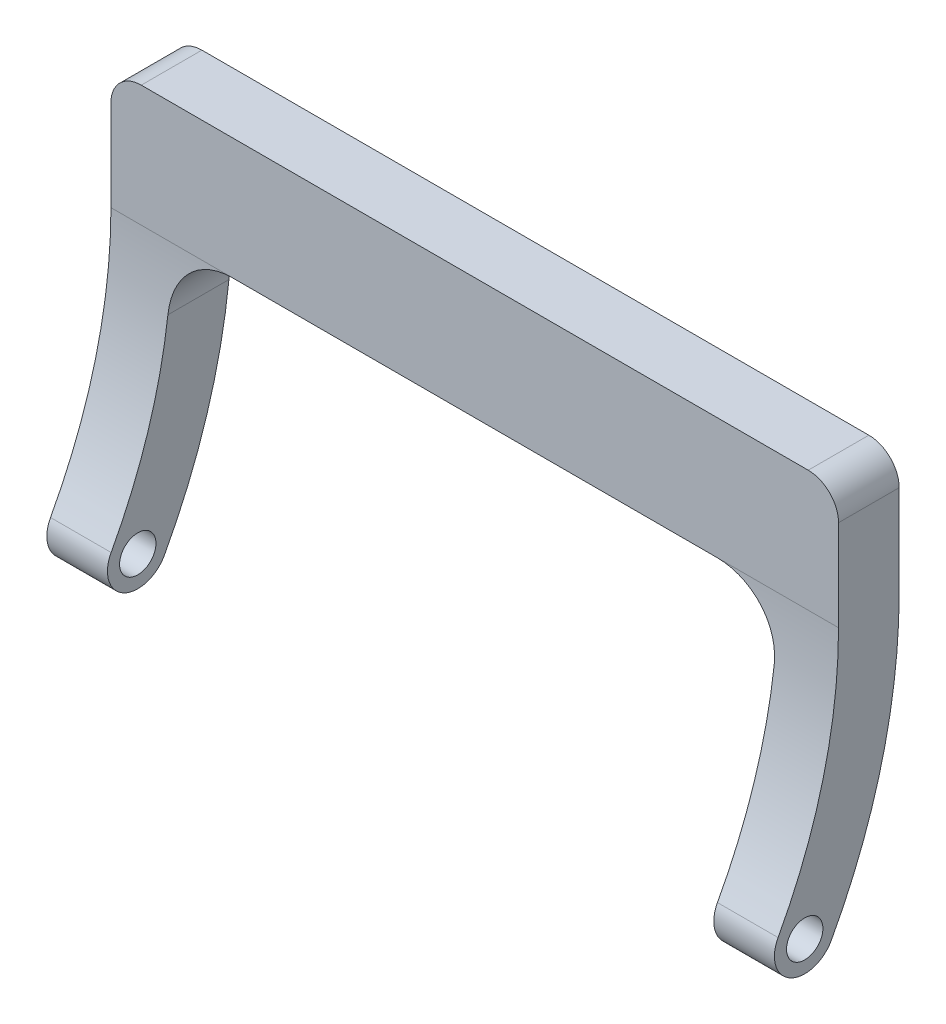
ISO-10303-21;
HEADER;
FILE_DESCRIPTION(('STEP AP214'),'2;1');
FILE_NAME('part.step','',(''),(''),'','','');
FILE_SCHEMA(('AUTOMOTIVE_DESIGN { 1 0 10303 214 1 1 1 1 }'));
ENDSEC;
DATA;
#1=APPLICATION_CONTEXT('core data for automotive mechanical design processes');
#2=APPLICATION_PROTOCOL_DEFINITION('international standard','automotive_design',2000,#1);
#3=PRODUCT_CONTEXT('',#1,'mechanical');
#4=PRODUCT('Part','Part','',(#3));
#5=PRODUCT_RELATED_PRODUCT_CATEGORY('part','',(#4));
#6=PRODUCT_DEFINITION_FORMATION('','',#4);
#7=PRODUCT_DEFINITION_CONTEXT('part definition',#1,'design');
#8=PRODUCT_DEFINITION('design','',#6,#7);
#9=PRODUCT_DEFINITION_SHAPE('','',#8);
#10=(LENGTH_UNIT() NAMED_UNIT(*) SI_UNIT(.MILLI.,.METRE.));
#11=(NAMED_UNIT(*) PLANE_ANGLE_UNIT() SI_UNIT($,.RADIAN.));
#12=(NAMED_UNIT(*) SI_UNIT($,.STERADIAN.) SOLID_ANGLE_UNIT());
#13=UNCERTAINTY_MEASURE_WITH_UNIT(LENGTH_MEASURE(1.E-05),#10,'distance_accuracy_value','');
#14=(GEOMETRIC_REPRESENTATION_CONTEXT(3) GLOBAL_UNCERTAINTY_ASSIGNED_CONTEXT((#13)) GLOBAL_UNIT_ASSIGNED_CONTEXT((#10,
#11,#12)) REPRESENTATION_CONTEXT('',''));
#15=CARTESIAN_POINT('',(0.,0.,0.));
#16=DIRECTION('',(0.,0.,1.));
#17=DIRECTION('',(1.,0.,0.));
#18=AXIS2_PLACEMENT_3D('',#15,#16,#17);
#19=CARTESIAN_POINT('',(-30.,-5.,5.));
#20=DIRECTION('',(0.,1.,0.));
#21=DIRECTION('',(0.,0.,1.));
#22=AXIS2_PLACEMENT_3D('',#19,#20,#21);
#23=PLANE('',#22);
#24=DIRECTION('',(1.,0.,0.));
#25=VECTOR('',#24,1.);
#26=CARTESIAN_POINT('',(-30.,-5.,5.));
#27=LINE('',#26,#25);
#28=CARTESIAN_POINT('',(-20.,-5.,5.));
#29=VERTEX_POINT('',#28);
#30=CARTESIAN_POINT('',(20.,-5.,5.));
#31=VERTEX_POINT('',#30);
#32=EDGE_CURVE('E253',#29,#31,#27,.T.);
#33=ORIENTED_EDGE('',*,*,#32,.F.);
#34=DIRECTION('',(0.,0.,1.));
#35=VECTOR('',#34,1.);
#36=CARTESIAN_POINT('',(-20.,-5.,0.));
#37=LINE('',#36,#35);
#38=CARTESIAN_POINT('',(-20.,-5.,0.));
#39=VERTEX_POINT('',#38);
#40=EDGE_CURVE('E111',#29,#39,#37,.F.);
#41=ORIENTED_EDGE('',*,*,#40,.T.);
#42=DIRECTION('',(1.,0.,0.));
#43=VECTOR('',#42,1.);
#44=CARTESIAN_POINT('',(-30.,-5.,0.));
#45=LINE('',#44,#43);
#46=CARTESIAN_POINT('',(20.,-5.,0.));
#47=VERTEX_POINT('',#46);
#48=EDGE_CURVE('E268',#39,#47,#45,.T.);
#49=ORIENTED_EDGE('',*,*,#48,.T.);
#50=DIRECTION('',(0.,0.,1.));
#51=VECTOR('',#50,1.);
#52=CARTESIAN_POINT('',(20.,-5.,5.));
#53=LINE('',#52,#51);
#54=EDGE_CURVE('E123',#47,#31,#53,.T.);
#55=ORIENTED_EDGE('',*,*,#54,.T.);
#56=EDGE_LOOP('',(#33,#41,#49,#55));
#57=FACE_BOUND('',#56,.T.);
#58=ADVANCED_FACE('F35',(#57),#23,.F.);
#59=CARTESIAN_POINT('',(30.,2.5,5.));
#60=DIRECTION('',(-1.,0.,0.));
#61=DIRECTION('',(0.,-1.,0.));
#62=AXIS2_PLACEMENT_3D('',#59,#60,#61);
#63=PLANE('',#62);
#64=DIRECTION('',(0.,1.,0.));
#65=VECTOR('',#64,1.);
#66=CARTESIAN_POINT('',(30.,2.5,0.));
#67=LINE('',#66,#65);
#68=CARTESIAN_POINT('',(30.,-5.,0.));
#69=VERTEX_POINT('',#68);
#70=CARTESIAN_POINT('',(30.,2.5,0.));
#71=VERTEX_POINT('',#70);
#72=EDGE_CURVE('E235',#69,#71,#67,.T.);
#73=ORIENTED_EDGE('',*,*,#72,.T.);
#74=DIRECTION('',(0.,0.,-1.));
#75=VECTOR('',#74,1.);
#76=CARTESIAN_POINT('',(30.,2.5,5.));
#77=LINE('',#76,#75);
#78=CARTESIAN_POINT('',(30.,2.5,5.));
#79=VERTEX_POINT('',#78);
#80=EDGE_CURVE('E129',#79,#71,#77,.T.);
#81=ORIENTED_EDGE('',*,*,#80,.F.);
#82=DIRECTION('',(0.,1.,0.));
#83=VECTOR('',#82,1.);
#84=CARTESIAN_POINT('',(30.,2.5,5.));
#85=LINE('',#84,#83);
#86=CARTESIAN_POINT('',(30.,-5.,5.));
#87=VERTEX_POINT('',#86);
#88=EDGE_CURVE('E238',#87,#79,#85,.T.);
#89=ORIENTED_EDGE('',*,*,#88,.F.);
#90=CARTESIAN_POINT('',(30.,-4.99999999999999,46.1643761087956));
#91=DIRECTION('',(-1.,0.,0.));
#92=DIRECTION('',(0.,0.,1.));
#93=AXIS2_PLACEMENT_3D('',#90,#91,#92);
#94=CIRCLE('',#93,41.1643761087957);
#95=CARTESIAN_POINT('',(30.,-24.6359543331277,9.98516719188165));
#96=VERTEX_POINT('',#95);
#97=EDGE_CURVE('E367',#87,#96,#94,.T.);
#98=ORIENTED_EDGE('',*,*,#97,.T.);
#99=CARTESIAN_POINT('',(30.,-25.8284875493017,7.78792698463948));
#100=DIRECTION('',(-1.,0.,0.));
#101=DIRECTION('',(0.,0.,1.));
#102=AXIS2_PLACEMENT_3D('',#99,#100,#101);
#103=CIRCLE('',#102,2.5);
#104=CARTESIAN_POINT('',(30.,-27.0210207654758,5.59068677739731));
#105=VERTEX_POINT('',#104);
#106=EDGE_CURVE('E376',#105,#96,#103,.T.);
#107=ORIENTED_EDGE('',*,*,#106,.F.);
#108=CARTESIAN_POINT('',(30.,-4.99999999999999,46.1643761087956));
#109=DIRECTION('',(-1.,0.,0.));
#110=DIRECTION('',(0.,0.,1.));
#111=AXIS2_PLACEMENT_3D('',#108,#109,#110);
#112=CIRCLE('',#111,46.1643761087956);
#113=EDGE_CURVE('E291',#69,#105,#112,.T.);
#114=ORIENTED_EDGE('',*,*,#113,.F.);
#115=EDGE_LOOP('',(#73,#81,#89,#98,#107,#114));
#116=FACE_BOUND('',#115,.T.);
#117=CARTESIAN_POINT('',(30.,-25.8284875493017,7.78792698463948));
#118=DIRECTION('',(-1.,0.,0.));
#119=DIRECTION('',(0.,0.,1.));
#120=AXIS2_PLACEMENT_3D('',#117,#118,#119);
#121=CIRCLE('',#120,1.5);
#122=CARTESIAN_POINT('',(30.,-25.8284875493017,9.28792698463948));
#123=VERTEX_POINT('',#122);
#124=EDGE_CURVE('E364',#123,#123,#121,.T.);
#125=ORIENTED_EDGE('',*,*,#124,.T.);
#126=EDGE_LOOP('',(#125));
#127=FACE_BOUND('',#126,.T.);
#128=ADVANCED_FACE('F153',(#116,#127),#63,.F.);
#129=CARTESIAN_POINT('',(27.5,2.5,5.));
#130=DIRECTION('',(0.,0.,-1.));
#131=DIRECTION('',(-1.,0.,0.));
#132=AXIS2_PLACEMENT_3D('',#129,#130,#131);
#133=CYLINDRICAL_SURFACE('',#132,2.5);
#134=CARTESIAN_POINT('',(27.5,2.5,0.));
#135=DIRECTION('',(0.,0.,1.));
#136=DIRECTION('',(-1.,0.,0.));
#137=AXIS2_PLACEMENT_3D('',#134,#135,#136);
#138=CIRCLE('',#137,2.5);
#139=CARTESIAN_POINT('',(27.5,5.,0.));
#140=VERTEX_POINT('',#139);
#141=EDGE_CURVE('E258',#71,#140,#138,.T.);
#142=ORIENTED_EDGE('',*,*,#141,.T.);
#143=DIRECTION('',(0.,0.,-1.));
#144=VECTOR('',#143,1.);
#145=CARTESIAN_POINT('',(27.5,5.,5.));
#146=LINE('',#145,#144);
#147=CARTESIAN_POINT('',(27.5,5.,5.));
#148=VERTEX_POINT('',#147);
#149=EDGE_CURVE('E274',#148,#140,#146,.T.);
#150=ORIENTED_EDGE('',*,*,#149,.F.);
#151=CARTESIAN_POINT('',(27.5,2.5,5.));
#152=DIRECTION('',(0.,0.,1.));
#153=DIRECTION('',(-1.,0.,0.));
#154=AXIS2_PLACEMENT_3D('',#151,#152,#153);
#155=CIRCLE('',#154,2.5);
#156=EDGE_CURVE('E241',#79,#148,#155,.T.);
#157=ORIENTED_EDGE('',*,*,#156,.F.);
#158=ORIENTED_EDGE('',*,*,#80,.T.);
#159=EDGE_LOOP('',(#142,#150,#157,#158));
#160=FACE_BOUND('',#159,.T.);
#161=ADVANCED_FACE('F157',(#160),#133,.T.);
#162=CARTESIAN_POINT('',(-27.5,5.,5.));
#163=DIRECTION('',(0.,-1.,0.));
#164=DIRECTION('',(0.,0.,-1.));
#165=AXIS2_PLACEMENT_3D('',#162,#163,#164);
#166=PLANE('',#165);
#167=DIRECTION('',(-1.,0.,0.));
#168=VECTOR('',#167,1.);
#169=CARTESIAN_POINT('',(-27.5,5.,0.));
#170=LINE('',#169,#168);
#171=CARTESIAN_POINT('',(-27.5,5.,0.));
#172=VERTEX_POINT('',#171);
#173=EDGE_CURVE('E261',#140,#172,#170,.T.);
#174=ORIENTED_EDGE('',*,*,#173,.T.);
#175=DIRECTION('',(0.,0.,-1.));
#176=VECTOR('',#175,1.);
#177=CARTESIAN_POINT('',(-27.5,5.,5.));
#178=LINE('',#177,#176);
#179=CARTESIAN_POINT('',(-27.5,5.,5.));
#180=VERTEX_POINT('',#179);
#181=EDGE_CURVE('E271',#180,#172,#178,.T.);
#182=ORIENTED_EDGE('',*,*,#181,.F.);
#183=DIRECTION('',(-1.,0.,0.));
#184=VECTOR('',#183,1.);
#185=CARTESIAN_POINT('',(-27.5,5.,5.));
#186=LINE('',#185,#184);
#187=EDGE_CURVE('E245',#148,#180,#186,.T.);
#188=ORIENTED_EDGE('',*,*,#187,.F.);
#189=ORIENTED_EDGE('',*,*,#149,.T.);
#190=EDGE_LOOP('',(#174,#182,#188,#189));
#191=FACE_BOUND('',#190,.T.);
#192=ADVANCED_FACE('F161',(#191),#166,.F.);
#193=CARTESIAN_POINT('',(-27.5,2.5,5.));
#194=DIRECTION('',(0.,0.,-1.));
#195=DIRECTION('',(-1.,0.,0.));
#196=AXIS2_PLACEMENT_3D('',#193,#194,#195);
#197=CYLINDRICAL_SURFACE('',#196,2.5);
#198=CARTESIAN_POINT('',(-27.5,2.5,0.));
#199=DIRECTION('',(0.,0.,1.));
#200=DIRECTION('',(1.,0.,0.));
#201=AXIS2_PLACEMENT_3D('',#198,#199,#200);
#202=CIRCLE('',#201,2.5);
#203=CARTESIAN_POINT('',(-30.,2.5,0.));
#204=VERTEX_POINT('',#203);
#205=EDGE_CURVE('E264',#172,#204,#202,.T.);
#206=ORIENTED_EDGE('',*,*,#205,.T.);
#207=DIRECTION('',(0.,0.,-1.));
#208=VECTOR('',#207,1.);
#209=CARTESIAN_POINT('',(-30.,2.5,5.));
#210=LINE('',#209,#208);
#211=CARTESIAN_POINT('',(-30.,2.5,5.));
#212=VERTEX_POINT('',#211);
#213=EDGE_CURVE('E255',#212,#204,#210,.T.);
#214=ORIENTED_EDGE('',*,*,#213,.F.);
#215=CARTESIAN_POINT('',(-27.5,2.5,5.));
#216=DIRECTION('',(0.,0.,1.));
#217=DIRECTION('',(1.,0.,0.));
#218=AXIS2_PLACEMENT_3D('',#215,#216,#217);
#219=CIRCLE('',#218,2.5);
#220=EDGE_CURVE('E248',#180,#212,#219,.T.);
#221=ORIENTED_EDGE('',*,*,#220,.F.);
#222=ORIENTED_EDGE('',*,*,#181,.T.);
#223=EDGE_LOOP('',(#206,#214,#221,#222));
#224=FACE_BOUND('',#223,.T.);
#225=ADVANCED_FACE('F165',(#224),#197,.T.);
#226=CARTESIAN_POINT('',(-30.,2.5,5.));
#227=DIRECTION('',(1.,0.,0.));
#228=DIRECTION('',(0.,1.,0.));
#229=AXIS2_PLACEMENT_3D('',#226,#227,#228);
#230=PLANE('',#229);
#231=DIRECTION('',(0.,-1.,0.));
#232=VECTOR('',#231,1.);
#233=CARTESIAN_POINT('',(-30.,2.5,0.));
#234=LINE('',#233,#232);
#235=CARTESIAN_POINT('',(-30.,-5.,0.));
#236=VERTEX_POINT('',#235);
#237=EDGE_CURVE('E224',#204,#236,#234,.T.);
#238=ORIENTED_EDGE('',*,*,#237,.T.);
#239=CARTESIAN_POINT('',(-30.,-4.99999999999999,46.1643761087956));
#240=DIRECTION('',(-1.,0.,0.));
#241=DIRECTION('',(0.,0.,1.));
#242=AXIS2_PLACEMENT_3D('',#239,#240,#241);
#243=CIRCLE('',#242,46.1643761087956);
#244=CARTESIAN_POINT('',(-30.,-27.0210207654758,5.59068677739731));
#245=VERTEX_POINT('',#244);
#246=EDGE_CURVE('E216',#236,#245,#243,.T.);
#247=ORIENTED_EDGE('',*,*,#246,.T.);
#248=CARTESIAN_POINT('',(-30.,-25.8284875493017,7.78792698463948));
#249=DIRECTION('',(-1.,0.,0.));
#250=DIRECTION('',(0.,0.,1.));
#251=AXIS2_PLACEMENT_3D('',#248,#249,#250);
#252=CIRCLE('',#251,2.5);
#253=CARTESIAN_POINT('',(-30.,-24.6359543331277,9.98516719188165));
#254=VERTEX_POINT('',#253);
#255=EDGE_CURVE('E202',#245,#254,#252,.T.);
#256=ORIENTED_EDGE('',*,*,#255,.T.);
#257=CARTESIAN_POINT('',(-30.,-4.99999999999999,46.1643761087956));
#258=DIRECTION('',(-1.,0.,0.));
#259=DIRECTION('',(0.,0.,1.));
#260=AXIS2_PLACEMENT_3D('',#257,#258,#259);
#261=CIRCLE('',#260,41.1643761087957);
#262=CARTESIAN_POINT('',(-30.,-5.,5.));
#263=VERTEX_POINT('',#262);
#264=EDGE_CURVE('E215',#263,#254,#261,.T.);
#265=ORIENTED_EDGE('',*,*,#264,.F.);
#266=DIRECTION('',(0.,-1.,0.));
#267=VECTOR('',#266,1.);
#268=CARTESIAN_POINT('',(-30.,2.5,5.));
#269=LINE('',#268,#267);
#270=EDGE_CURVE('E251',#212,#263,#269,.T.);
#271=ORIENTED_EDGE('',*,*,#270,.F.);
#272=ORIENTED_EDGE('',*,*,#213,.T.);
#273=EDGE_LOOP('',(#238,#247,#256,#265,#271,#272));
#274=FACE_BOUND('',#273,.T.);
#275=CARTESIAN_POINT('',(-30.,-25.8284875493017,7.78792698463948));
#276=DIRECTION('',(-1.,0.,0.));
#277=DIRECTION('',(0.,0.,1.));
#278=AXIS2_PLACEMENT_3D('',#275,#276,#277);
#279=CIRCLE('',#278,1.5);
#280=CARTESIAN_POINT('',(-30.,-25.8284875493017,9.28792698463948));
#281=VERTEX_POINT('',#280);
#282=EDGE_CURVE('E226',#281,#281,#279,.T.);
#283=ORIENTED_EDGE('',*,*,#282,.F.);
#284=EDGE_LOOP('',(#283));
#285=FACE_BOUND('',#284,.T.);
#286=ADVANCED_FACE('F169',(#274,#285),#230,.F.);
#287=CARTESIAN_POINT('',(-27.5,2.5,5.));
#288=DIRECTION('',(0.,0.,1.));
#289=DIRECTION('',(1.,0.,0.));
#290=AXIS2_PLACEMENT_3D('',#287,#288,#289);
#291=PLANE('',#290);
#292=ORIENTED_EDGE('',*,*,#88,.T.);
#293=ORIENTED_EDGE('',*,*,#156,.T.);
#294=ORIENTED_EDGE('',*,*,#187,.T.);
#295=ORIENTED_EDGE('',*,*,#220,.T.);
#296=ORIENTED_EDGE('',*,*,#270,.T.);
#297=EDGE_CURVE('E65',#263,#29,#27,.T.);
#298=ORIENTED_EDGE('',*,*,#297,.T.);
#299=ORIENTED_EDGE('',*,*,#32,.T.);
#300=DIRECTION('',(1.,0.,0.));
#301=VECTOR('',#300,1.);
#302=CARTESIAN_POINT('',(25.,-5.,5.));
#303=LINE('',#302,#301);
#304=EDGE_CURVE('E80',#31,#87,#303,.T.);
#305=ORIENTED_EDGE('',*,*,#304,.T.);
#306=EDGE_LOOP('',(#292,#293,#294,#295,#296,#298,#299,#305));
#307=FACE_BOUND('',#306,.T.);
#308=ADVANCED_FACE('F173',(#307),#291,.T.);
#309=CARTESIAN_POINT('',(-27.5,2.5,0.));
#310=DIRECTION('',(0.,0.,1.));
#311=DIRECTION('',(1.,0.,0.));
#312=AXIS2_PLACEMENT_3D('',#309,#310,#311);
#313=PLANE('',#312);
#314=ORIENTED_EDGE('',*,*,#72,.F.);
#315=DIRECTION('',(1.,0.,0.));
#316=VECTOR('',#315,1.);
#317=CARTESIAN_POINT('',(25.,-5.,0.));
#318=LINE('',#317,#316);
#319=EDGE_CURVE('E56',#47,#69,#318,.T.);
#320=ORIENTED_EDGE('',*,*,#319,.F.);
#321=ORIENTED_EDGE('',*,*,#48,.F.);
#322=EDGE_CURVE('E242',#236,#39,#45,.T.);
#323=ORIENTED_EDGE('',*,*,#322,.F.);
#324=ORIENTED_EDGE('',*,*,#237,.F.);
#325=ORIENTED_EDGE('',*,*,#205,.F.);
#326=ORIENTED_EDGE('',*,*,#173,.F.);
#327=ORIENTED_EDGE('',*,*,#141,.F.);
#328=EDGE_LOOP('',(#314,#320,#321,#323,#324,#325,#326,#327));
#329=FACE_BOUND('',#328,.T.);
#330=ADVANCED_FACE('F177',(#329),#313,.F.);
#331=CARTESIAN_POINT('',(-25.,-4.99999999999999,46.1643761087956));
#332=DIRECTION('',(-1.,0.,0.));
#333=DIRECTION('',(0.,0.,1.));
#334=AXIS2_PLACEMENT_3D('',#331,#332,#333);
#335=CYLINDRICAL_SURFACE('',#334,46.1643761087956);
#336=ORIENTED_EDGE('',*,*,#246,.F.);
#337=ORIENTED_EDGE('',*,*,#322,.T.);
#338=CARTESIAN_POINT('',(-20.,-5.,0.));
#339=CARTESIAN_POINT('',(-20.1406139638009,-4.99998488468588,4.83904575289081E-06));
#340=CARTESIAN_POINT('',(-20.281225759382,-5.00593105166425,1.51962508173939E-07));
#341=CARTESIAN_POINT('',(-20.561443606279,-5.02963678468084,6.69877063063935E-06));
#342=CARTESIAN_POINT('',(-20.7010497050229,-5.0473957898966,1.79319062033465E-05));
#343=CARTESIAN_POINT('',(-20.9781663883125,-5.09460069485828,9.12592392409603E-05));
#344=CARTESIAN_POINT('',(-21.1156784379656,-5.12403799314064,0.00015331603905995));
#345=CARTESIAN_POINT('',(-21.3877339526114,-5.19438535825617,0.000395774702306673));
#346=CARTESIAN_POINT('',(-21.5222774538468,-5.23529528493789,0.000576175120065977));
#347=CARTESIAN_POINT('',(-21.787482676486,-5.32831303804834,0.001144076132979));
#348=CARTESIAN_POINT('',(-21.9181431839548,-5.38042432528331,0.00153164078936844));
#349=CARTESIAN_POINT('',(-22.1746572321374,-5.49548751443703,0.00262328817170416));
#350=CARTESIAN_POINT('',(-22.3005089776012,-5.55844341757251,0.00332748787791887));
#351=CARTESIAN_POINT('',(-22.5463914034577,-5.69469676293655,0.00517708192130554));
#352=CARTESIAN_POINT('',(-22.6664252012424,-5.76798858275537,0.00632223697500768));
#353=CARTESIAN_POINT('',(-22.8999330715601,-5.92444525251249,0.00919066051003719));
#354=CARTESIAN_POINT('',(-23.013404714071,-6.00761372548689,0.0109141415635933));
#355=CARTESIAN_POINT('',(-23.232836929809,-6.1831311665817,0.0150801384345135));
#356=CARTESIAN_POINT('',(-23.3388038556348,-6.27547220727076,0.0175220368767382));
#357=CARTESIAN_POINT('',(-23.5426142222004,-6.46876558325907,0.0232697253709081));
#358=CARTESIAN_POINT('',(-23.6404548219868,-6.56972090530244,0.0265758158821044));
#359=CARTESIAN_POINT('',(-23.827271809415,-6.77948523541517,0.0341900560062663));
#360=CARTESIAN_POINT('',(-23.9162484172505,-6.88829404827714,0.0384981807184511));
#361=CARTESIAN_POINT('',(-24.0847075314802,-7.11298076161201,0.0482447029734056));
#362=CARTESIAN_POINT('',(-24.1641900512449,-7.22885865212913,0.0536830989243773));
#363=CARTESIAN_POINT('',(-24.3129718569188,-7.46664080194855,0.0657920854605129));
#364=CARTESIAN_POINT('',(-24.3822882717338,-7.58853445101962,0.0724605596534724));
#365=CARTESIAN_POINT('',(-24.5103929462695,-7.8376027661476,0.0871237059568745));
#366=CARTESIAN_POINT('',(-24.5691848176103,-7.96477560206372,0.0951179213026289));
#367=CARTESIAN_POINT('',(-24.6758544915777,-8.22349930615522,0.112498068135968));
#368=CARTESIAN_POINT('',(-24.7237347120242,-8.35504919703822,0.121883690551242));
#369=CARTESIAN_POINT('',(-24.8082657215431,-8.62154746742499,0.142078378847114));
#370=CARTESIAN_POINT('',(-24.8449190889818,-8.75649505889457,0.152887117077454));
#371=CARTESIAN_POINT('',(-24.9171359192813,-9.07453139523494,0.179802349039489));
#372=CARTESIAN_POINT('',(-24.9482298808524,-9.25861782543424,0.196471264520216));
#373=CARTESIAN_POINT('',(-24.9793008332238,-9.53606944556732,0.22330129327049));
#374=CARTESIAN_POINT('',(-24.9870628226017,-9.62872533206822,0.232543821349943));
#375=CARTESIAN_POINT('',(-24.9974116774699,-9.8142567518541,0.251619141241801));
#376=CARTESIAN_POINT('',(-24.9999990085216,-9.90713226462663,0.261451879871271));
#377=CARTESIAN_POINT('',(-25.,-10.,0.271570338017785));
#378=B_SPLINE_CURVE_WITH_KNOTS('',3,(#338,#339,#340,#341,#342,#343,#344,#345,#346,#347,#348,
#349,#350,#351,#352,#353,#354,#355,#356,#357,#358,#359,#360,#361,#362,#363,#364,#365,#366,#367,
#368,#369,#370,#371,#372,#373,#374,#375,#376,#377),.UNSPECIFIED.,.F.,.F.,(4,2,2,2,2,2,2,2,2,2,2,
2,2,2,2,2,2,2,2,4),(0.,0.421713166995336,0.843406314303184,1.2647894450636,1.68616742836481,
2.10767578949572,2.52934000427369,2.95077572559923,3.37236652181456,3.79359607513219,
4.2149722753005,4.63633800529163,5.05770314186366,5.4783499550452,5.89885214048325,
6.31926105962399,6.7395733548638,7.30054203250258,7.58073636845385,7.86090549433027),.UNSPECIFIED.);
#379=CARTESIAN_POINT('',(-25.,-10.,0.271570338017786));
#380=VERTEX_POINT('',#379);
#381=EDGE_CURVE('E139',#39,#380,#378,.T.);
#382=ORIENTED_EDGE('',*,*,#381,.T.);
#383=CARTESIAN_POINT('',(-25.,-4.99999999999999,46.1643761087956));
#384=DIRECTION('',(-1.,0.,0.));
#385=DIRECTION('',(0.,0.,1.));
#386=AXIS2_PLACEMENT_3D('',#383,#384,#385);
#387=CIRCLE('',#386,46.1643761087956);
#388=CARTESIAN_POINT('',(-25.,-27.0210207654758,5.59068677739731));
#389=VERTEX_POINT('',#388);
#390=EDGE_CURVE('E305',#380,#389,#387,.T.);
#391=ORIENTED_EDGE('',*,*,#390,.T.);
#392=DIRECTION('',(-1.,0.,0.));
#393=VECTOR('',#392,1.);
#394=CARTESIAN_POINT('',(-25.,-27.0210207654758,5.59068677739731));
#395=LINE('',#394,#393);
#396=EDGE_CURVE('E207',#389,#245,#395,.T.);
#397=ORIENTED_EDGE('',*,*,#396,.T.);
#398=EDGE_LOOP('',(#336,#337,#382,#391,#397));
#399=FACE_BOUND('',#398,.T.);
#400=ADVANCED_FACE('F180',(#399),#335,.T.);
#401=CARTESIAN_POINT('',(-25.,-4.99999999999999,46.1643761087956));
#402=DIRECTION('',(-1.,0.,0.));
#403=DIRECTION('',(0.,0.,1.));
#404=AXIS2_PLACEMENT_3D('',#401,#402,#403);
#405=CYLINDRICAL_SURFACE('',#404,41.1643761087957);
#406=ORIENTED_EDGE('',*,*,#264,.T.);
#407=DIRECTION('',(-1.,0.,0.));
#408=VECTOR('',#407,1.);
#409=CARTESIAN_POINT('',(-25.,-24.6359543331277,9.98516719188165));
#410=LINE('',#409,#408);
#411=CARTESIAN_POINT('',(-25.,-24.6359543331277,9.98516719188165));
#412=VERTEX_POINT('',#411);
#413=EDGE_CURVE('E211',#412,#254,#410,.T.);
#414=ORIENTED_EDGE('',*,*,#413,.F.);
#415=CARTESIAN_POINT('',(-25.,-4.99999999999999,46.1643761087956));
#416=DIRECTION('',(-1.,0.,0.));
#417=DIRECTION('',(0.,0.,1.));
#418=AXIS2_PLACEMENT_3D('',#415,#416,#417);
#419=CIRCLE('',#418,41.1643761087957);
#420=CARTESIAN_POINT('',(-25.,-10.,5.30478897888957));
#421=VERTEX_POINT('',#420);
#422=EDGE_CURVE('E237',#421,#412,#419,.T.);
#423=ORIENTED_EDGE('',*,*,#422,.F.);
#424=CARTESIAN_POINT('',(-25.,-10.,5.30478897888957));
#425=CARTESIAN_POINT('',(-25.0000153690319,-9.86051070623084,5.28771242398482));
#426=CARTESIAN_POINT('',(-24.9941633743073,-9.7209309519259,5.27136397263972));
#427=CARTESIAN_POINT('',(-24.9707895762654,-9.44258073793622,5.24019264881989));
#428=CARTESIAN_POINT('',(-24.9532677741372,-9.30381027816904,5.2253697761897));
#429=CARTESIAN_POINT('',(-24.906634417361,-9.0281583166751,5.19732808036995));
#430=CARTESIAN_POINT('',(-24.8775303917129,-8.89127564748391,5.1841082224134));
#431=CARTESIAN_POINT('',(-24.8079090312046,-8.62029850769297,5.15928130513518));
#432=CARTESIAN_POINT('',(-24.7673920100312,-8.48620396057026,5.14767420149996));
#433=CARTESIAN_POINT('',(-24.6751768798474,-8.22170054165065,5.1260509982105));
#434=CARTESIAN_POINT('',(-24.6234726551845,-8.09129373007391,5.11603577399619));
#435=CARTESIAN_POINT('',(-24.5092222459201,-7.83514715707973,5.09754890360685));
#436=CARTESIAN_POINT('',(-24.4466720499381,-7.70940914338083,5.0890778309222));
#437=CARTESIAN_POINT('',(-24.3112169296977,-7.46364765954309,5.0736052034498));
#438=CARTESIAN_POINT('',(-24.2383184563127,-7.34362069104573,5.06660273985258));
#439=CARTESIAN_POINT('',(-24.0826201574436,-7.11003090764495,5.05394776314279));
#440=CARTESIAN_POINT('',(-23.9998166943436,-6.99647049032674,5.04829574828192));
#441=CARTESIAN_POINT('',(-23.8252876369027,-6.77715475734212,5.03823377083121));
#442=CARTESIAN_POINT('',(-23.7336013006114,-6.67136843253083,5.03381865104339));
#443=CARTESIAN_POINT('',(-23.541626325137,-6.46779612298998,5.02605070307618));
#444=CARTESIAN_POINT('',(-23.4413345063046,-6.37001312171834,5.0226982697164));
#445=CARTESIAN_POINT('',(-23.2329030006662,-6.18320544594981,5.01690207070874));
#446=CARTESIAN_POINT('',(-23.1247644292374,-6.09417953089753,5.01445817621776));
#447=CARTESIAN_POINT('',(-22.9013527091846,-5.92547509833846,5.01031821463221));
#448=CARTESIAN_POINT('',(-22.7860770267145,-5.84579992997783,5.00862241488552));
#449=CARTESIAN_POINT('',(-22.549044319772,-5.69627595883284,5.00582093915819));
#450=CARTESIAN_POINT('',(-22.4272768371743,-5.62644371508697,5.0047162490924));
#451=CARTESIAN_POINT('',(-22.1783016927584,-5.49725939912519,5.00295280615948));
#452=CARTESIAN_POINT('',(-22.0510939951913,-5.43790739579021,5.00229405622319));
#453=CARTESIAN_POINT('',(-21.7921921589228,-5.33012902400814,5.00128848793133));
#454=CARTESIAN_POINT('',(-21.6605000775171,-5.28169772118336,5.00094152848484));
#455=CARTESIAN_POINT('',(-21.3935609792238,-5.19608031874695,5.00044482662684));
#456=CARTESIAN_POINT('',(-21.2583146992725,-5.15889190769196,5.00029504365624));
#457=CARTESIAN_POINT('',(-20.937844843423,-5.08512471100326,5.00006572544522));
#458=CARTESIAN_POINT('',(-20.7515157773999,-5.05320619135469,5.00002840943303));
#459=CARTESIAN_POINT('',(-20.4704472860686,-5.02128735187574,5.00000436691045));
#460=CARTESIAN_POINT('',(-20.3765390252458,-5.01330756898042,5.00000166854052));
#461=CARTESIAN_POINT('',(-20.1884286468962,-5.00266461001358,4.99999988077679));
#462=CARTESIAN_POINT('',(-20.0942265516551,-5.00000104010616,5.00000079111563));
#463=CARTESIAN_POINT('',(-20.,-5.,5.));
#464=B_SPLINE_CURVE_WITH_KNOTS('',3,(#424,#425,#426,#427,#428,#429,#430,#431,#432,#433,#434,
#435,#436,#437,#438,#439,#440,#441,#442,#443,#444,#445,#446,#447,#448,#449,#450,#451,#452,#453,
#454,#455,#456,#457,#458,#459,#460,#461,#462,#463),.UNSPECIFIED.,.F.,.F.,(4,2,2,2,2,2,2,2,2,2,2,
2,2,2,2,2,2,2,2,4),(0.,0.421470400847864,0.842940758751807,1.26413758709923,1.68532283995604,
2.10673892441437,2.52831120328717,2.94962182861173,3.37108765841492,3.79076911802376,
4.21060631951729,4.63038395968558,5.05031149521729,5.47093726393545,5.89156579709506,
6.31200389213232,6.73235548978322,7.29810545692839,7.58071960673842,7.86331281913755),.UNSPECIFIED.);
#465=EDGE_CURVE('E89',#421,#29,#464,.T.);
#466=ORIENTED_EDGE('',*,*,#465,.T.);
#467=ORIENTED_EDGE('',*,*,#297,.F.);
#468=EDGE_LOOP('',(#406,#414,#423,#466,#467));
#469=FACE_BOUND('',#468,.T.);
#470=ADVANCED_FACE('F145',(#469),#405,.F.);
#471=CARTESIAN_POINT('',(-25.,-25.8284875493017,7.78792698463948));
#472=DIRECTION('',(-1.,0.,0.));
#473=DIRECTION('',(0.,0.,1.));
#474=AXIS2_PLACEMENT_3D('',#471,#472,#473);
#475=CYLINDRICAL_SURFACE('',#474,1.5);
#476=CARTESIAN_POINT('',(-25.,-25.8284875493017,7.78792698463948));
#477=DIRECTION('',(-1.,0.,0.));
#478=DIRECTION('',(0.,0.,1.));
#479=AXIS2_PLACEMENT_3D('',#476,#477,#478);
#480=CIRCLE('',#479,1.5);
#481=CARTESIAN_POINT('',(-25.,-25.8284875493017,9.28792698463948));
#482=VERTEX_POINT('',#481);
#483=EDGE_CURVE('E233',#482,#482,#480,.T.);
#484=ORIENTED_EDGE('',*,*,#483,.F.);
#485=EDGE_LOOP('',(#484));
#486=FACE_BOUND('',#485,.T.);
#487=ORIENTED_EDGE('',*,*,#282,.T.);
#488=EDGE_LOOP('',(#487));
#489=FACE_BOUND('',#488,.T.);
#490=ADVANCED_FACE('F183',(#486,#489),#475,.F.);
#491=CARTESIAN_POINT('',(-25.,-25.8284875493017,7.78792698463948));
#492=DIRECTION('',(-1.,0.,0.));
#493=DIRECTION('',(0.,0.,1.));
#494=AXIS2_PLACEMENT_3D('',#491,#492,#493);
#495=CYLINDRICAL_SURFACE('',#494,2.5);
#496=ORIENTED_EDGE('',*,*,#255,.F.);
#497=ORIENTED_EDGE('',*,*,#396,.F.);
#498=CARTESIAN_POINT('',(-25.,-25.8284875493017,7.78792698463948));
#499=DIRECTION('',(-1.,0.,0.));
#500=DIRECTION('',(0.,0.,1.));
#501=AXIS2_PLACEMENT_3D('',#498,#499,#500);
#502=CIRCLE('',#501,2.5);
#503=EDGE_CURVE('E308',#389,#412,#502,.T.);
#504=ORIENTED_EDGE('',*,*,#503,.T.);
#505=ORIENTED_EDGE('',*,*,#413,.T.);
#506=EDGE_LOOP('',(#496,#497,#504,#505));
#507=FACE_BOUND('',#506,.T.);
#508=ADVANCED_FACE('F185',(#507),#495,.T.);
#509=CARTESIAN_POINT('',(-25.,0.,0.));
#510=DIRECTION('',(-1.,0.,0.));
#511=DIRECTION('',(0.,0.,1.));
#512=AXIS2_PLACEMENT_3D('',#509,#510,#511);
#513=PLANE('',#512);
#514=ORIENTED_EDGE('',*,*,#483,.T.);
#515=EDGE_LOOP('',(#514));
#516=FACE_BOUND('',#515,.T.);
#517=ORIENTED_EDGE('',*,*,#390,.F.);
#518=DIRECTION('',(0.,0.,1.));
#519=VECTOR('',#518,1.);
#520=CARTESIAN_POINT('',(-25.,-10.,5.));
#521=LINE('',#520,#519);
#522=EDGE_CURVE('E125',#380,#421,#521,.T.);
#523=ORIENTED_EDGE('',*,*,#522,.T.);
#524=ORIENTED_EDGE('',*,*,#422,.T.);
#525=ORIENTED_EDGE('',*,*,#503,.F.);
#526=EDGE_LOOP('',(#517,#523,#524,#525));
#527=FACE_BOUND('',#526,.T.);
#528=ADVANCED_FACE('F191',(#516,#527),#513,.F.);
#529=CARTESIAN_POINT('',(25.,-4.99999999999999,46.1643761087956));
#530=DIRECTION('',(1.,0.,0.));
#531=DIRECTION('',(0.,0.,-1.));
#532=AXIS2_PLACEMENT_3D('',#529,#530,#531);
#533=CYLINDRICAL_SURFACE('',#532,46.1643761087956);
#534=ORIENTED_EDGE('',*,*,#113,.T.);
#535=DIRECTION('',(1.,0.,0.));
#536=VECTOR('',#535,1.);
#537=CARTESIAN_POINT('',(25.,-27.0210207654758,5.59068677739731));
#538=LINE('',#537,#536);
#539=CARTESIAN_POINT('',(25.,-27.0210207654758,5.59068677739731));
#540=VERTEX_POINT('',#539);
#541=EDGE_CURVE('E119',#540,#105,#538,.T.);
#542=ORIENTED_EDGE('',*,*,#541,.F.);
#543=CARTESIAN_POINT('',(25.,-4.99999999999999,46.1643761087956));
#544=DIRECTION('',(-1.,0.,0.));
#545=DIRECTION('',(0.,0.,1.));
#546=AXIS2_PLACEMENT_3D('',#543,#544,#545);
#547=CIRCLE('',#546,46.1643761087956);
#548=CARTESIAN_POINT('',(25.,-10.,0.271570338017786));
#549=VERTEX_POINT('',#548);
#550=EDGE_CURVE('E105',#549,#540,#547,.T.);
#551=ORIENTED_EDGE('',*,*,#550,.F.);
#552=CARTESIAN_POINT('',(25.,-10.,0.271570338017779));
#553=CARTESIAN_POINT('',(25.0000153215328,-9.86027649912681,0.256341089850706));
#554=CARTESIAN_POINT('',(24.9941437725345,-9.72048147649954,0.241762381118397));
#555=CARTESIAN_POINT('',(24.9707008723229,-9.44174098457,0.213967867917417));
#556=CARTESIAN_POINT('',(24.9531296360924,-9.30279550693208,0.200752050055919));
#557=CARTESIAN_POINT('',(24.9063769878087,-9.02683652810975,0.175753231809391));
#558=CARTESIAN_POINT('',(24.8772033737809,-8.88982179317516,0.163969275992299));
#559=CARTESIAN_POINT('',(24.8074301321461,-8.6186176805605,0.141841113337641));
#560=CARTESIAN_POINT('',(24.7668307831244,-8.48442823407919,0.131496871405765));
#561=CARTESIAN_POINT('',(24.674447069301,-8.21977557700983,0.112228673409283));
#562=CARTESIAN_POINT('',(24.6226571444401,-8.08931425536338,0.103305427211196));
#563=CARTESIAN_POINT('',(24.5082350772556,-7.8330875253048,0.0868357567346315));
#564=CARTESIAN_POINT('',(24.4455989256218,-7.70732387436103,0.0792898437139153));
#565=CARTESIAN_POINT('',(24.3099739451543,-7.46153301954083,0.0655082144367567));
#566=CARTESIAN_POINT('',(24.2369914042362,-7.34150239027936,0.0592717080712183));
#567=CARTESIAN_POINT('',(24.0811296624637,-7.10792449315529,0.0480020651197655));
#568=CARTESIAN_POINT('',(23.9982468258433,-6.99437962988083,0.0429693726699637));
#569=CARTESIAN_POINT('',(23.8234961236431,-6.7750234913889,0.0340073265655513));
#570=CARTESIAN_POINT('',(23.7316602208545,-6.66918690281258,0.0300742287617515));
#571=CARTESIAN_POINT('',(23.5393789366063,-6.4655389166935,0.023155881942386));
#572=CARTESIAN_POINT('',(23.4389303703742,-6.3677305141915,0.0201709854869995));
#573=CARTESIAN_POINT('',(23.2301805337403,-6.18089647481018,0.0150116481938545));
#574=CARTESIAN_POINT('',(23.1218804214948,-6.09186954715863,0.0128370881153753));
#575=CARTESIAN_POINT('',(22.8981420139258,-5.9231865031522,0.00915462312863465));
#576=CARTESIAN_POINT('',(22.7827011855895,-5.84353374149815,0.00764695634997585));
#577=CARTESIAN_POINT('',(22.5453755940509,-5.69410264874955,0.00515777433002142));
#578=CARTESIAN_POINT('',(22.4234824530408,-5.62433761057507,0.0041769625374201));
#579=CARTESIAN_POINT('',(22.1742599534075,-5.49530402030669,0.0026120573405686));
#580=CARTESIAN_POINT('',(22.0469305616201,-5.43603553225899,0.00202796635690523));
#581=CARTESIAN_POINT('',(21.7877917100563,-5.32844038365231,0.00113699272783412));
#582=CARTESIAN_POINT('',(21.655984331233,-5.28010871854843,0.000829983100705727));
#583=CARTESIAN_POINT('',(21.3888219106466,-5.19470598432546,0.000390928494043361));
#584=CARTESIAN_POINT('',(21.2534676133555,-5.15763257242404,0.000258847093625041));
#585=CARTESIAN_POINT('',(20.9336757519212,-5.08436327790309,5.75629049970574E-05));
#586=CARTESIAN_POINT('',(20.7481612722331,-5.0527298146279,2.48808099195553E-05));
#587=CARTESIAN_POINT('',(20.4683378549023,-5.02109652748923,3.82438058663652E-06));
#588=CARTESIAN_POINT('',(20.3748491267794,-5.013188256642,1.46123352849112E-06));
#589=CARTESIAN_POINT('',(20.1875816096827,-5.00264068774169,-1.04387155383005E-07));
#590=CARTESIAN_POINT('',(20.0938028420288,-5.00000101121539,6.92912173697392E-07));
#591=CARTESIAN_POINT('',(20.,-5.,0.));
#592=B_SPLINE_CURVE_WITH_KNOTS('',3,(#552,#553,#554,#555,#556,#557,#558,#559,#560,#561,#562,
#563,#564,#565,#566,#567,#568,#569,#570,#571,#572,#573,#574,#575,#576,#577,#578,#579,#580,#581,
#582,#583,#584,#585,#586,#587,#588,#589,#590,#591),.UNSPECIFIED.,.F.,.F.,(4,2,2,2,2,2,2,2,2,2,2,
2,2,2,2,2,2,2,2,4),(0.,0.421529955478317,0.843055768280306,1.26429874862922,1.68553145900538,
2.10697394290119,2.528572546971,2.94991601841398,3.37141470172645,3.79146018804981,
4.2116616733537,4.6318013017134,5.05209082973245,5.47294013576496,5.89379200958091,
6.31445091598824,6.7350222254453,7.29823870618609,7.57958226795588,7.86090561848423),.UNSPECIFIED.);
#593=EDGE_CURVE('E11',#549,#47,#592,.T.);
#594=ORIENTED_EDGE('',*,*,#593,.T.);
#595=ORIENTED_EDGE('',*,*,#319,.T.);
#596=EDGE_LOOP('',(#534,#542,#551,#594,#595));
#597=FACE_BOUND('',#596,.T.);
#598=ADVANCED_FACE('F116',(#597),#533,.T.);
#599=CARTESIAN_POINT('',(25.,-25.8284875493017,7.78792698463948));
#600=DIRECTION('',(1.,0.,0.));
#601=DIRECTION('',(0.,0.,-1.));
#602=AXIS2_PLACEMENT_3D('',#599,#600,#601);
#603=CYLINDRICAL_SURFACE('',#602,2.5);
#604=ORIENTED_EDGE('',*,*,#106,.T.);
#605=DIRECTION('',(1.,0.,0.));
#606=VECTOR('',#605,1.);
#607=CARTESIAN_POINT('',(25.,-24.6359543331277,9.98516719188165));
#608=LINE('',#607,#606);
#609=CARTESIAN_POINT('',(25.,-24.6359543331277,9.98516719188165));
#610=VERTEX_POINT('',#609);
#611=EDGE_CURVE('E298',#610,#96,#608,.T.);
#612=ORIENTED_EDGE('',*,*,#611,.F.);
#613=CARTESIAN_POINT('',(25.,-25.8284875493017,7.78792698463948));
#614=DIRECTION('',(-1.,0.,0.));
#615=DIRECTION('',(0.,0.,1.));
#616=AXIS2_PLACEMENT_3D('',#613,#614,#615);
#617=CIRCLE('',#616,2.5);
#618=EDGE_CURVE('E296',#540,#610,#617,.T.);
#619=ORIENTED_EDGE('',*,*,#618,.F.);
#620=ORIENTED_EDGE('',*,*,#541,.T.);
#621=EDGE_LOOP('',(#604,#612,#619,#620));
#622=FACE_BOUND('',#621,.T.);
#623=ADVANCED_FACE('F348',(#622),#603,.T.);
#624=CARTESIAN_POINT('',(25.,-4.99999999999999,46.1643761087956));
#625=DIRECTION('',(1.,0.,0.));
#626=DIRECTION('',(0.,0.,-1.));
#627=AXIS2_PLACEMENT_3D('',#624,#625,#626);
#628=CYLINDRICAL_SURFACE('',#627,41.1643761087957);
#629=ORIENTED_EDGE('',*,*,#97,.F.);
#630=ORIENTED_EDGE('',*,*,#304,.F.);
#631=CARTESIAN_POINT('',(20.,-5.,5.));
#632=CARTESIAN_POINT('',(20.140609759233,-4.99998488649478,5.00000542617527));
#633=CARTESIAN_POINT('',(20.2812173508405,-5.00593069704259,5.00000017040188));
#634=CARTESIAN_POINT('',(20.561426897091,-5.02963501518569,5.00000751153268));
#635=CARTESIAN_POINT('',(20.7010288990305,-5.04739296349661,5.00002010759164));
#636=CARTESIAN_POINT('',(20.97813829183,-5.09459519131861,5.00010233202837));
#637=CARTESIAN_POINT('',(21.1156471372695,-5.12403093091787,5.00017191876864));
#638=CARTESIAN_POINT('',(21.3876964503238,-5.19437463001741,5.00044379853188));
#639=CARTESIAN_POINT('',(21.5222369541854,-5.23528244934654,5.00064608993344));
#640=CARTESIAN_POINT('',(21.7874366254355,-5.32829551691968,5.00128290716009));
#641=CARTESIAN_POINT('',(21.9180945719686,-5.38040424571177,5.00171750523424));
#642=CARTESIAN_POINT('',(22.1746035894854,-5.49546172624222,5.00294163805676));
#643=CARTESIAN_POINT('',(22.3004528651087,-5.55841447929725,5.00373130399479));
#644=CARTESIAN_POINT('',(22.5463302835559,-5.69466074021306,5.00580539131351));
#645=CARTESIAN_POINT('',(22.6663615390823,-5.76794863474493,5.00708954477394));
#646=CARTESIAN_POINT('',(22.8998636972824,-5.92439606302667,5.01030615908912));
#647=CARTESIAN_POINT('',(23.0133321703112,-6.00755921840418,5.01223885826726));
#648=CARTESIAN_POINT('',(23.2327430073209,-6.18305252806101,5.01691031110151));
#649=CARTESIAN_POINT('',(23.3386926578561,-6.27537359333469,5.01964827075673));
#650=CARTESIAN_POINT('',(23.5424687689414,-6.46862079609185,5.02609272035464));
#651=CARTESIAN_POINT('',(23.6402923882977,-6.56954991851541,5.02979954719032));
#652=CARTESIAN_POINT('',(23.8270743320644,-6.77925212444988,5.03833653735419));
#653=CARTESIAN_POINT('',(23.9160329823876,-6.88802491934143,5.04316665936362));
#654=CARTESIAN_POINT('',(24.0844565466937,-7.11262784157828,5.05409390694972));
#655=CARTESIAN_POINT('',(24.1639214790984,-7.22845795522866,5.06019103006778));
#656=CARTESIAN_POINT('',(24.3126298220547,-7.46606580417871,5.07376276047256));
#657=CARTESIAN_POINT('',(24.3818956937068,-7.5878296594638,5.08123425678265));
#658=CARTESIAN_POINT('',(24.5099139458587,-7.83661339794066,5.09766184879135));
#659=CARTESIAN_POINT('',(24.5686699346386,-7.96363145873359,5.106617432927));
#660=CARTESIAN_POINT('',(24.675287374329,-8.22202019931126,5.12608642956089));
#661=CARTESIAN_POINT('',(24.7231510301312,-8.35338999201335,5.13659952606544));
#662=CARTESIAN_POINT('',(24.8076722647136,-8.61949796558159,5.15921860265915));
#663=CARTESIAN_POINT('',(24.8443323895244,-8.75423537360834,5.17132421994812));
#664=CARTESIAN_POINT('',(24.9167713641562,-9.0724990643678,5.20153872597526));
#665=CARTESIAN_POINT('',(24.948007661937,-9.257029606267,5.22028888489121));
#666=CARTESIAN_POINT('',(24.979215292013,-9.53510927387562,5.25047426021539));
#667=CARTESIAN_POINT('',(24.9870100390641,-9.62796771219199,5.26087344887567));
#668=CARTESIAN_POINT('',(24.9974016375308,-9.81388940842004,5.28233740706065));
#669=CARTESIAN_POINT('',(24.9999989849711,-9.90695264593755,5.29340211296647));
#670=CARTESIAN_POINT('',(25.,-10.,5.30478897888957));
#671=B_SPLINE_CURVE_WITH_KNOTS('',3,(#631,#632,#633,#634,#635,#636,#637,#638,#639,#640,#641,
#642,#643,#644,#645,#646,#647,#648,#649,#650,#651,#652,#653,#654,#655,#656,#657,#658,#659,#660,
#661,#662,#663,#664,#665,#666,#667,#668,#669,#670),.UNSPECIFIED.,.F.,.F.,(4,2,2,2,2,2,2,2,2,2,2,
2,2,2,2,2,2,2,2,4),(0.,0.421700565472006,0.843381165569939,1.26475395946606,1.6861216050603,
2.10762037536036,2.52927500818543,2.95070150335175,3.37228303150135,3.79345025859646,
4.21476412858803,4.63606250362486,5.05736006114717,5.47771546589149,5.89792627497376,
6.3180519466389,6.73808207257033,7.30100392008635,7.58217173673226,7.86331271825377),.UNSPECIFIED.);
#672=CARTESIAN_POINT('',(25.,-10.,5.30478897888957));
#673=VERTEX_POINT('',#672);
#674=EDGE_CURVE('E49',#31,#673,#671,.T.);
#675=ORIENTED_EDGE('',*,*,#674,.T.);
#676=CARTESIAN_POINT('',(25.,-4.99999999999999,46.1643761087956));
#677=DIRECTION('',(-1.,0.,0.));
#678=DIRECTION('',(0.,0.,1.));
#679=AXIS2_PLACEMENT_3D('',#676,#677,#678);
#680=CIRCLE('',#679,41.1643761087957);
#681=EDGE_CURVE('E108',#673,#610,#680,.T.);
#682=ORIENTED_EDGE('',*,*,#681,.T.);
#683=ORIENTED_EDGE('',*,*,#611,.T.);
#684=EDGE_LOOP('',(#629,#630,#675,#682,#683));
#685=FACE_BOUND('',#684,.T.);
#686=ADVANCED_FACE('F343',(#685),#628,.F.);
#687=CARTESIAN_POINT('',(25.,-25.8284875493017,7.78792698463948));
#688=DIRECTION('',(1.,0.,0.));
#689=DIRECTION('',(0.,0.,-1.));
#690=AXIS2_PLACEMENT_3D('',#687,#688,#689);
#691=CYLINDRICAL_SURFACE('',#690,1.5);
#692=CARTESIAN_POINT('',(25.,-25.8284875493017,7.78792698463948));
#693=DIRECTION('',(-1.,0.,0.));
#694=DIRECTION('',(0.,0.,1.));
#695=AXIS2_PLACEMENT_3D('',#692,#693,#694);
#696=CIRCLE('',#695,1.5);
#697=CARTESIAN_POINT('',(25.,-25.8284875493017,9.28792698463948));
#698=VERTEX_POINT('',#697);
#699=EDGE_CURVE('E120',#698,#698,#696,.T.);
#700=ORIENTED_EDGE('',*,*,#699,.T.);
#701=EDGE_LOOP('',(#700));
#702=FACE_BOUND('',#701,.T.);
#703=ORIENTED_EDGE('',*,*,#124,.F.);
#704=EDGE_LOOP('',(#703));
#705=FACE_BOUND('',#704,.T.);
#706=ADVANCED_FACE('F347',(#702,#705),#691,.F.);
#707=CARTESIAN_POINT('',(25.,0.,0.));
#708=DIRECTION('',(1.,0.,0.));
#709=DIRECTION('',(0.,0.,1.));
#710=AXIS2_PLACEMENT_3D('',#707,#708,#709);
#711=PLANE('',#710);
#712=ORIENTED_EDGE('',*,*,#699,.F.);
#713=EDGE_LOOP('',(#712));
#714=FACE_BOUND('',#713,.T.);
#715=ORIENTED_EDGE('',*,*,#681,.F.);
#716=DIRECTION('',(0.,0.,1.));
#717=VECTOR('',#716,1.);
#718=CARTESIAN_POINT('',(25.,-10.,0.));
#719=LINE('',#718,#717);
#720=EDGE_CURVE('E100',#673,#549,#719,.F.);
#721=ORIENTED_EDGE('',*,*,#720,.T.);
#722=ORIENTED_EDGE('',*,*,#550,.T.);
#723=ORIENTED_EDGE('',*,*,#618,.T.);
#724=EDGE_LOOP('',(#715,#721,#722,#723));
#725=FACE_BOUND('',#724,.T.);
#726=ADVANCED_FACE('F102',(#714,#725),#711,.F.);
#727=CARTESIAN_POINT('',(-20.,-10.,0.));
#728=DIRECTION('',(0.,0.,-1.));
#729=DIRECTION('',(-1.,0.,0.));
#730=AXIS2_PLACEMENT_3D('',#727,#728,#729);
#731=CYLINDRICAL_SURFACE('',#730,5.);
#732=ORIENTED_EDGE('',*,*,#381,.F.);
#733=ORIENTED_EDGE('',*,*,#40,.F.);
#734=ORIENTED_EDGE('',*,*,#465,.F.);
#735=ORIENTED_EDGE('',*,*,#522,.F.);
#736=EDGE_LOOP('',(#732,#733,#734,#735));
#737=FACE_BOUND('',#736,.T.);
#738=ADVANCED_FACE('F149',(#737),#731,.F.);
#739=CARTESIAN_POINT('',(20.,-10.,5.));
#740=DIRECTION('',(0.,0.,-1.));
#741=DIRECTION('',(-1.,0.,0.));
#742=AXIS2_PLACEMENT_3D('',#739,#740,#741);
#743=CYLINDRICAL_SURFACE('',#742,5.);
#744=ORIENTED_EDGE('',*,*,#593,.F.);
#745=ORIENTED_EDGE('',*,*,#720,.F.);
#746=ORIENTED_EDGE('',*,*,#674,.F.);
#747=ORIENTED_EDGE('',*,*,#54,.F.);
#748=EDGE_LOOP('',(#744,#745,#746,#747));
#749=FACE_BOUND('',#748,.T.);
#750=ADVANCED_FACE('F37',(#749),#743,.F.);
#751=CLOSED_SHELL('',(#58,#128,#161,#192,#225,#286,#308,#330,#400,#470,#490,#508,#528,#598,#623,
#686,#706,#726,#738,#750));
#752=CARTESIAN_POINT('',(20.,0.,3.5));
#753=DIRECTION('',(0.,0.,-1.));
#754=DIRECTION('',(-1.,0.,0.));
#755=AXIS2_PLACEMENT_3D('',#752,#753,#754);
#756=CYLINDRICAL_SURFACE('',#755,2.);
#757=CARTESIAN_POINT('',(20.,0.,3.5));
#758=DIRECTION('',(0.,0.,-1.));
#759=DIRECTION('',(-1.,0.,0.));
#760=AXIS2_PLACEMENT_3D('',#757,#758,#759);
#761=CIRCLE('',#760,2.);
#762=CARTESIAN_POINT('',(18.,0.,3.5));
#763=VERTEX_POINT('',#762);
#764=EDGE_CURVE('E365',#763,#763,#761,.T.);
#765=ORIENTED_EDGE('',*,*,#764,.F.);
#766=EDGE_LOOP('',(#765));
#767=FACE_BOUND('',#766,.T.);
#768=CARTESIAN_POINT('',(20.,0.,1.5));
#769=DIRECTION('',(0.,0.,-1.));
#770=DIRECTION('',(-1.,0.,0.));
#771=AXIS2_PLACEMENT_3D('',#768,#769,#770);
#772=CIRCLE('',#771,2.);
#773=CARTESIAN_POINT('',(18.,0.,1.5));
#774=VERTEX_POINT('',#773);
#775=EDGE_CURVE('E370',#774,#774,#772,.T.);
#776=ORIENTED_EDGE('',*,*,#775,.T.);
#777=EDGE_LOOP('',(#776));
#778=FACE_BOUND('',#777,.T.);
#779=ADVANCED_FACE('F428',(#767,#778),#756,.F.);
#780=CARTESIAN_POINT('',(20.,0.,3.5));
#781=DIRECTION('',(0.,0.,-1.));
#782=DIRECTION('',(-1.,0.,0.));
#783=AXIS2_PLACEMENT_3D('',#780,#781,#782);
#784=PLANE('',#783);
#785=ORIENTED_EDGE('',*,*,#764,.T.);
#786=EDGE_LOOP('',(#785));
#787=FACE_BOUND('',#786,.T.);
#788=ADVANCED_FACE('F431',(#787),#784,.T.);
#789=CARTESIAN_POINT('',(20.,0.,1.5));
#790=DIRECTION('',(0.,0.,-1.));
#791=DIRECTION('',(-1.,0.,0.));
#792=AXIS2_PLACEMENT_3D('',#789,#790,#791);
#793=PLANE('',#792);
#794=ORIENTED_EDGE('',*,*,#775,.F.);
#795=EDGE_LOOP('',(#794));
#796=FACE_BOUND('',#795,.T.);
#797=ADVANCED_FACE('F442',(#796),#793,.F.);
#798=CLOSED_SHELL('',(#779,#788,#797));
#799=CARTESIAN_POINT('',(-20.,0.,3.5));
#800=DIRECTION('',(0.,0.,-1.));
#801=DIRECTION('',(-1.,0.,0.));
#802=AXIS2_PLACEMENT_3D('',#799,#800,#801);
#803=CYLINDRICAL_SURFACE('',#802,2.);
#804=CARTESIAN_POINT('',(-20.,0.,3.5));
#805=DIRECTION('',(0.,0.,-1.));
#806=DIRECTION('',(-1.,0.,0.));
#807=AXIS2_PLACEMENT_3D('',#804,#805,#806);
#808=CIRCLE('',#807,2.);
#809=CARTESIAN_POINT('',(-22.,0.,3.5));
#810=VERTEX_POINT('',#809);
#811=EDGE_CURVE('E494',#810,#810,#808,.T.);
#812=ORIENTED_EDGE('',*,*,#811,.F.);
#813=EDGE_LOOP('',(#812));
#814=FACE_BOUND('',#813,.T.);
#815=CARTESIAN_POINT('',(-20.,0.,1.5));
#816=DIRECTION('',(0.,0.,-1.));
#817=DIRECTION('',(-1.,0.,0.));
#818=AXIS2_PLACEMENT_3D('',#815,#816,#817);
#819=CIRCLE('',#818,2.);
#820=CARTESIAN_POINT('',(-22.,0.,1.5));
#821=VERTEX_POINT('',#820);
#822=EDGE_CURVE('E492',#821,#821,#819,.T.);
#823=ORIENTED_EDGE('',*,*,#822,.T.);
#824=EDGE_LOOP('',(#823));
#825=FACE_BOUND('',#824,.T.);
#826=ADVANCED_FACE('F459',(#814,#825),#803,.F.);
#827=CARTESIAN_POINT('',(-20.,0.,3.5));
#828=DIRECTION('',(0.,0.,-1.));
#829=DIRECTION('',(-1.,0.,0.));
#830=AXIS2_PLACEMENT_3D('',#827,#828,#829);
#831=PLANE('',#830);
#832=ORIENTED_EDGE('',*,*,#811,.T.);
#833=EDGE_LOOP('',(#832));
#834=FACE_BOUND('',#833,.T.);
#835=ADVANCED_FACE('F462',(#834),#831,.T.);
#836=CARTESIAN_POINT('',(-20.,0.,1.5));
#837=DIRECTION('',(0.,0.,-1.));
#838=DIRECTION('',(-1.,0.,0.));
#839=AXIS2_PLACEMENT_3D('',#836,#837,#838);
#840=PLANE('',#839);
#841=ORIENTED_EDGE('',*,*,#822,.F.);
#842=EDGE_LOOP('',(#841));
#843=FACE_BOUND('',#842,.T.);
#844=ADVANCED_FACE('F474',(#843),#840,.F.);
#845=CLOSED_SHELL('',(#826,#835,#844));
#846=ORIENTED_CLOSED_SHELL('',*,#798,.T.);
#847=ORIENTED_CLOSED_SHELL('',*,#845,.T.);
#848=BREP_WITH_VOIDS('B2',#751,(#846,#847));
#849=ADVANCED_BREP_SHAPE_REPRESENTATION('',(#18,#848),#14);
#850=SHAPE_DEFINITION_REPRESENTATION(#9,#849);
ENDSEC;
END-ISO-10303-21;
